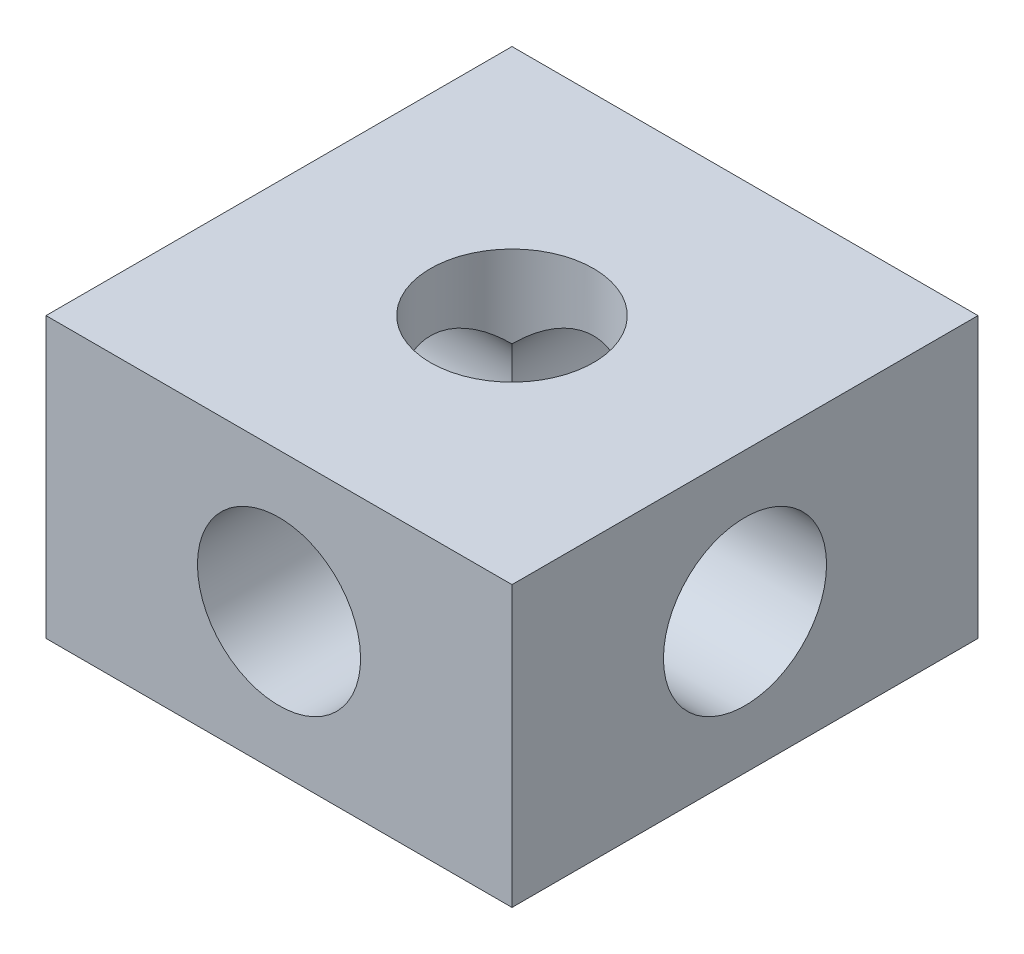
ISO-10303-21;
HEADER;
FILE_DESCRIPTION(('STEP AP214'),'2;1');
FILE_NAME('part.step','',(''),(''),'','','');
FILE_SCHEMA(('AUTOMOTIVE_DESIGN { 1 0 10303 214 1 1 1 1 }'));
ENDSEC;
DATA;
#1=APPLICATION_CONTEXT('core data for automotive mechanical design processes');
#2=APPLICATION_PROTOCOL_DEFINITION('international standard','automotive_design',2000,#1);
#3=PRODUCT_CONTEXT('',#1,'mechanical');
#4=PRODUCT('Part','Part','',(#3));
#5=PRODUCT_RELATED_PRODUCT_CATEGORY('part','',(#4));
#6=PRODUCT_DEFINITION_FORMATION('','',#4);
#7=PRODUCT_DEFINITION_CONTEXT('part definition',#1,'design');
#8=PRODUCT_DEFINITION('design','',#6,#7);
#9=PRODUCT_DEFINITION_SHAPE('','',#8);
#10=(LENGTH_UNIT() NAMED_UNIT(*) SI_UNIT(.MILLI.,.METRE.));
#11=(NAMED_UNIT(*) PLANE_ANGLE_UNIT() SI_UNIT($,.RADIAN.));
#12=(NAMED_UNIT(*) SI_UNIT($,.STERADIAN.) SOLID_ANGLE_UNIT());
#13=UNCERTAINTY_MEASURE_WITH_UNIT(LENGTH_MEASURE(1.E-05),#10,'distance_accuracy_value','');
#14=(GEOMETRIC_REPRESENTATION_CONTEXT(3) GLOBAL_UNCERTAINTY_ASSIGNED_CONTEXT((#13)) GLOBAL_UNIT_ASSIGNED_CONTEXT((#10,
#11,#12)) REPRESENTATION_CONTEXT('',''));
#15=CARTESIAN_POINT('',(0.,0.,0.));
#16=DIRECTION('',(0.,0.,1.));
#17=DIRECTION('',(1.,0.,0.));
#18=AXIS2_PLACEMENT_3D('',#15,#16,#17);
#19=CARTESIAN_POINT('',(0.,3.,0.));
#20=DIRECTION('',(0.,-1.,0.));
#21=DIRECTION('',(0.,0.,-1.));
#22=AXIS2_PLACEMENT_3D('',#19,#20,#21);
#23=CYLINDRICAL_SURFACE('',#22,1.75);
#24=CARTESIAN_POINT('',(0.,0.,0.));
#25=DIRECTION('',(0.707106781186547,-0.707106781186547,0.));
#26=DIRECTION('',(-0.707106781186547,-0.707106781186547,0.));
#27=AXIS2_PLACEMENT_3D('',#24,#25,#26);
#28=ELLIPSE('',#27,2.47487373415292,1.75);
#29=CARTESIAN_POINT('',(1.23743686707646,1.23743686707646,1.23743686707646));
#30=VERTEX_POINT('',#29);
#31=CARTESIAN_POINT('',(1.23743686707646,1.23743686707646,-1.23743686707646));
#32=VERTEX_POINT('',#31);
#33=EDGE_CURVE('E100',#30,#32,#28,.F.);
#34=ORIENTED_EDGE('',*,*,#33,.F.);
#35=CARTESIAN_POINT('',(0.,0.,0.));
#36=DIRECTION('',(0.,-0.707106781186547,0.707106781186547));
#37=DIRECTION('',(0.,-0.707106781186547,-0.707106781186547));
#38=AXIS2_PLACEMENT_3D('',#35,#36,#37);
#39=ELLIPSE('',#38,2.47487373415292,1.75);
#40=CARTESIAN_POINT('',(-1.23743686707646,1.23743686707646,1.23743686707646));
#41=VERTEX_POINT('',#40);
#42=EDGE_CURVE('E106',#41,#30,#39,.F.);
#43=ORIENTED_EDGE('',*,*,#42,.F.);
#44=CARTESIAN_POINT('',(0.,0.,0.));
#45=DIRECTION('',(-0.707106781186547,-0.707106781186547,0.));
#46=DIRECTION('',(0.707106781186547,-0.707106781186547,0.));
#47=AXIS2_PLACEMENT_3D('',#44,#45,#46);
#48=ELLIPSE('',#47,2.47487373415292,1.75);
#49=CARTESIAN_POINT('',(-1.23743686707646,1.23743686707646,-1.23743686707646));
#50=VERTEX_POINT('',#49);
#51=EDGE_CURVE('E59',#50,#41,#48,.F.);
#52=ORIENTED_EDGE('',*,*,#51,.F.);
#53=CARTESIAN_POINT('',(0.,0.,0.));
#54=DIRECTION('',(0.,-0.707106781186547,-0.707106781186547));
#55=DIRECTION('',(0.,-0.707106781186547,0.707106781186547));
#56=AXIS2_PLACEMENT_3D('',#53,#54,#55);
#57=ELLIPSE('',#56,2.47487373415292,1.75);
#58=EDGE_CURVE('E112',#32,#50,#57,.F.);
#59=ORIENTED_EDGE('',*,*,#58,.F.);
#60=EDGE_LOOP('',(#34,#43,#52,#59));
#61=FACE_BOUND('',#60,.T.);
#62=CARTESIAN_POINT('',(0.,3.,0.));
#63=DIRECTION('',(0.,1.,0.));
#64=DIRECTION('',(0.,0.,1.));
#65=AXIS2_PLACEMENT_3D('',#62,#63,#64);
#66=CIRCLE('',#65,1.75);
#67=CARTESIAN_POINT('',(0.,3.,1.75));
#68=VERTEX_POINT('',#67);
#69=EDGE_CURVE('E148',#68,#68,#66,.T.);
#70=ORIENTED_EDGE('',*,*,#69,.T.);
#71=EDGE_LOOP('',(#70));
#72=FACE_BOUND('',#71,.T.);
#73=ADVANCED_FACE('F36',(#61,#72),#23,.F.);
#74=CARTESIAN_POINT('',(0.,3.,0.));
#75=DIRECTION('',(0.,1.,0.));
#76=DIRECTION('',(0.,0.,1.));
#77=AXIS2_PLACEMENT_3D('',#74,#75,#76);
#78=PLANE('',#77);
#79=DIRECTION('',(0.,0.,-1.));
#80=VECTOR('',#79,1.);
#81=CARTESIAN_POINT('',(5.,3.,-5.));
#82=LINE('',#81,#80);
#83=CARTESIAN_POINT('',(5.,3.,5.));
#84=VERTEX_POINT('',#83);
#85=CARTESIAN_POINT('',(5.,3.,-5.));
#86=VERTEX_POINT('',#85);
#87=EDGE_CURVE('E140',#84,#86,#82,.T.);
#88=ORIENTED_EDGE('',*,*,#87,.T.);
#89=DIRECTION('',(-1.,0.,0.));
#90=VECTOR('',#89,1.);
#91=CARTESIAN_POINT('',(-5.,3.,-5.));
#92=LINE('',#91,#90);
#93=CARTESIAN_POINT('',(-5.,3.,-5.));
#94=VERTEX_POINT('',#93);
#95=EDGE_CURVE('E152',#86,#94,#92,.T.);
#96=ORIENTED_EDGE('',*,*,#95,.T.);
#97=DIRECTION('',(0.,0.,1.));
#98=VECTOR('',#97,1.);
#99=CARTESIAN_POINT('',(-5.,3.,-5.));
#100=LINE('',#99,#98);
#101=CARTESIAN_POINT('',(-5.,3.,5.));
#102=VERTEX_POINT('',#101);
#103=EDGE_CURVE('E150',#94,#102,#100,.T.);
#104=ORIENTED_EDGE('',*,*,#103,.T.);
#105=DIRECTION('',(1.,0.,0.));
#106=VECTOR('',#105,1.);
#107=CARTESIAN_POINT('',(-5.,3.,5.));
#108=LINE('',#107,#106);
#109=EDGE_CURVE('E137',#102,#84,#108,.T.);
#110=ORIENTED_EDGE('',*,*,#109,.T.);
#111=EDGE_LOOP('',(#88,#96,#104,#110));
#112=FACE_BOUND('',#111,.T.);
#113=ORIENTED_EDGE('',*,*,#69,.F.);
#114=EDGE_LOOP('',(#113));
#115=FACE_BOUND('',#114,.T.);
#116=ADVANCED_FACE('F216',(#112,#115),#78,.T.);
#117=CARTESIAN_POINT('',(0.,-3.,0.));
#118=DIRECTION('',(0.,1.,0.));
#119=DIRECTION('',(0.,0.,1.));
#120=AXIS2_PLACEMENT_3D('',#117,#118,#119);
#121=PLANE('',#120);
#122=DIRECTION('',(0.,0.,-1.));
#123=VECTOR('',#122,1.);
#124=CARTESIAN_POINT('',(5.,-3.,-5.));
#125=LINE('',#124,#123);
#126=CARTESIAN_POINT('',(5.,-3.,5.));
#127=VERTEX_POINT('',#126);
#128=CARTESIAN_POINT('',(5.,-3.,-5.));
#129=VERTEX_POINT('',#128);
#130=EDGE_CURVE('E145',#127,#129,#125,.T.);
#131=ORIENTED_EDGE('',*,*,#130,.F.);
#132=DIRECTION('',(1.,0.,0.));
#133=VECTOR('',#132,1.);
#134=CARTESIAN_POINT('',(-5.,-3.,5.));
#135=LINE('',#134,#133);
#136=CARTESIAN_POINT('',(-5.,-3.,5.));
#137=VERTEX_POINT('',#136);
#138=EDGE_CURVE('E138',#137,#127,#135,.T.);
#139=ORIENTED_EDGE('',*,*,#138,.F.);
#140=DIRECTION('',(0.,0.,1.));
#141=VECTOR('',#140,1.);
#142=CARTESIAN_POINT('',(-5.,-3.,-5.));
#143=LINE('',#142,#141);
#144=CARTESIAN_POINT('',(-5.,-3.,-5.));
#145=VERTEX_POINT('',#144);
#146=EDGE_CURVE('E141',#145,#137,#143,.T.);
#147=ORIENTED_EDGE('',*,*,#146,.F.);
#148=DIRECTION('',(-1.,0.,0.));
#149=VECTOR('',#148,1.);
#150=CARTESIAN_POINT('',(-5.,-3.,-5.));
#151=LINE('',#150,#149);
#152=EDGE_CURVE('E143',#129,#145,#151,.T.);
#153=ORIENTED_EDGE('',*,*,#152,.F.);
#154=EDGE_LOOP('',(#131,#139,#147,#153));
#155=FACE_BOUND('',#154,.T.);
#156=CARTESIAN_POINT('',(0.,-3.,0.));
#157=DIRECTION('',(0.,1.,0.));
#158=DIRECTION('',(0.,0.,1.));
#159=AXIS2_PLACEMENT_3D('',#156,#157,#158);
#160=CIRCLE('',#159,1.75);
#161=CARTESIAN_POINT('',(0.,-3.,1.75));
#162=VERTEX_POINT('',#161);
#163=EDGE_CURVE('E156',#162,#162,#160,.T.);
#164=ORIENTED_EDGE('',*,*,#163,.T.);
#165=EDGE_LOOP('',(#164));
#166=FACE_BOUND('',#165,.T.);
#167=ADVANCED_FACE('F210',(#155,#166),#121,.F.);
#168=CARTESIAN_POINT('',(5.,3.,-5.));
#169=DIRECTION('',(-1.,0.,0.));
#170=DIRECTION('',(0.,0.,1.));
#171=AXIS2_PLACEMENT_3D('',#168,#169,#170);
#172=PLANE('',#171);
#173=CARTESIAN_POINT('',(5.,0.,0.));
#174=DIRECTION('',(-1.,0.,0.));
#175=DIRECTION('',(0.,0.,1.));
#176=AXIS2_PLACEMENT_3D('',#173,#174,#175);
#177=CIRCLE('',#176,1.75);
#178=CARTESIAN_POINT('',(5.,0.,1.75));
#179=VERTEX_POINT('',#178);
#180=EDGE_CURVE('E167',#179,#179,#177,.T.);
#181=ORIENTED_EDGE('',*,*,#180,.T.);
#182=EDGE_LOOP('',(#181));
#183=FACE_BOUND('',#182,.T.);
#184=ORIENTED_EDGE('',*,*,#130,.T.);
#185=DIRECTION('',(0.,-1.,0.));
#186=VECTOR('',#185,1.);
#187=CARTESIAN_POINT('',(5.,3.,-5.));
#188=LINE('',#187,#186);
#189=EDGE_CURVE('E125',#86,#129,#188,.T.);
#190=ORIENTED_EDGE('',*,*,#189,.F.);
#191=ORIENTED_EDGE('',*,*,#87,.F.);
#192=DIRECTION('',(0.,-1.,0.));
#193=VECTOR('',#192,1.);
#194=CARTESIAN_POINT('',(5.,3.,5.));
#195=LINE('',#194,#193);
#196=EDGE_CURVE('E134',#84,#127,#195,.T.);
#197=ORIENTED_EDGE('',*,*,#196,.T.);
#198=EDGE_LOOP('',(#184,#190,#191,#197));
#199=FACE_BOUND('',#198,.T.);
#200=ADVANCED_FACE('F38',(#183,#199),#172,.F.);
#201=CARTESIAN_POINT('',(-5.,3.,-5.));
#202=DIRECTION('',(0.,0.,1.));
#203=DIRECTION('',(1.,0.,0.));
#204=AXIS2_PLACEMENT_3D('',#201,#202,#203);
#205=PLANE('',#204);
#206=CARTESIAN_POINT('',(0.,0.,-5.));
#207=DIRECTION('',(0.,0.,1.));
#208=DIRECTION('',(1.,0.,0.));
#209=AXIS2_PLACEMENT_3D('',#206,#207,#208);
#210=CIRCLE('',#209,1.75);
#211=CARTESIAN_POINT('',(1.75,0.,-5.));
#212=VERTEX_POINT('',#211);
#213=EDGE_CURVE('E159',#212,#212,#210,.T.);
#214=ORIENTED_EDGE('',*,*,#213,.T.);
#215=EDGE_LOOP('',(#214));
#216=FACE_BOUND('',#215,.T.);
#217=ORIENTED_EDGE('',*,*,#152,.T.);
#218=DIRECTION('',(0.,-1.,0.));
#219=VECTOR('',#218,1.);
#220=CARTESIAN_POINT('',(-5.,3.,-5.));
#221=LINE('',#220,#219);
#222=EDGE_CURVE('E128',#94,#145,#221,.T.);
#223=ORIENTED_EDGE('',*,*,#222,.F.);
#224=ORIENTED_EDGE('',*,*,#95,.F.);
#225=ORIENTED_EDGE('',*,*,#189,.T.);
#226=EDGE_LOOP('',(#217,#223,#224,#225));
#227=FACE_BOUND('',#226,.T.);
#228=ADVANCED_FACE('F198',(#216,#227),#205,.F.);
#229=CARTESIAN_POINT('',(-5.,3.,-5.));
#230=DIRECTION('',(1.,0.,0.));
#231=DIRECTION('',(0.,0.,-1.));
#232=AXIS2_PLACEMENT_3D('',#229,#230,#231);
#233=PLANE('',#232);
#234=CARTESIAN_POINT('',(-5.,0.,0.));
#235=DIRECTION('',(1.,0.,0.));
#236=DIRECTION('',(0.,0.,-1.));
#237=AXIS2_PLACEMENT_3D('',#234,#235,#236);
#238=CIRCLE('',#237,1.75);
#239=CARTESIAN_POINT('',(-5.,0.,-1.75));
#240=VERTEX_POINT('',#239);
#241=EDGE_CURVE('E170',#240,#240,#238,.T.);
#242=ORIENTED_EDGE('',*,*,#241,.T.);
#243=EDGE_LOOP('',(#242));
#244=FACE_BOUND('',#243,.T.);
#245=ORIENTED_EDGE('',*,*,#146,.T.);
#246=DIRECTION('',(0.,-1.,0.));
#247=VECTOR('',#246,1.);
#248=CARTESIAN_POINT('',(-5.,3.,5.));
#249=LINE('',#248,#247);
#250=EDGE_CURVE('E131',#102,#137,#249,.T.);
#251=ORIENTED_EDGE('',*,*,#250,.F.);
#252=ORIENTED_EDGE('',*,*,#103,.F.);
#253=ORIENTED_EDGE('',*,*,#222,.T.);
#254=EDGE_LOOP('',(#245,#251,#252,#253));
#255=FACE_BOUND('',#254,.T.);
#256=ADVANCED_FACE('F194',(#244,#255),#233,.F.);
#257=CARTESIAN_POINT('',(-5.,3.,5.));
#258=DIRECTION('',(0.,0.,-1.));
#259=DIRECTION('',(-1.,0.,0.));
#260=AXIS2_PLACEMENT_3D('',#257,#258,#259);
#261=PLANE('',#260);
#262=CARTESIAN_POINT('',(0.,0.,5.));
#263=DIRECTION('',(0.,0.,-1.));
#264=DIRECTION('',(-1.,0.,0.));
#265=AXIS2_PLACEMENT_3D('',#262,#263,#264);
#266=CIRCLE('',#265,1.75);
#267=CARTESIAN_POINT('',(-1.75,0.,5.));
#268=VERTEX_POINT('',#267);
#269=EDGE_CURVE('E164',#268,#268,#266,.T.);
#270=ORIENTED_EDGE('',*,*,#269,.T.);
#271=EDGE_LOOP('',(#270));
#272=FACE_BOUND('',#271,.T.);
#273=ORIENTED_EDGE('',*,*,#138,.T.);
#274=ORIENTED_EDGE('',*,*,#196,.F.);
#275=ORIENTED_EDGE('',*,*,#109,.F.);
#276=ORIENTED_EDGE('',*,*,#250,.T.);
#277=EDGE_LOOP('',(#273,#274,#275,#276));
#278=FACE_BOUND('',#277,.T.);
#279=ADVANCED_FACE('F197',(#272,#278),#261,.F.);
#280=CARTESIAN_POINT('',(0.,0.,0.));
#281=DIRECTION('',(0.707106781186547,-0.707106781186547,0.));
#282=DIRECTION('',(-0.707106781186547,-0.707106781186547,0.));
#283=AXIS2_PLACEMENT_3D('',#280,#281,#282);
#284=ELLIPSE('',#283,2.47487373415292,1.75);
#285=CARTESIAN_POINT('',(-1.23743686707646,-1.23743686707646,1.23743686707646));
#286=VERTEX_POINT('',#285);
#287=CARTESIAN_POINT('',(-1.23743686707646,-1.23743686707646,-1.23743686707646));
#288=VERTEX_POINT('',#287);
#289=EDGE_CURVE('E177',#286,#288,#284,.T.);
#290=ORIENTED_EDGE('',*,*,#289,.F.);
#291=CARTESIAN_POINT('',(0.,0.,0.));
#292=DIRECTION('',(0.,-0.707106781186547,-0.707106781186547));
#293=DIRECTION('',(0.,-0.707106781186547,0.707106781186547));
#294=AXIS2_PLACEMENT_3D('',#291,#292,#293);
#295=ELLIPSE('',#294,2.47487373415292,1.75);
#296=CARTESIAN_POINT('',(1.23743686707646,-1.23743686707646,1.23743686707646));
#297=VERTEX_POINT('',#296);
#298=EDGE_CURVE('E120',#297,#286,#295,.T.);
#299=ORIENTED_EDGE('',*,*,#298,.F.);
#300=CARTESIAN_POINT('',(0.,0.,0.));
#301=DIRECTION('',(-0.707106781186547,-0.707106781186547,0.));
#302=DIRECTION('',(0.707106781186547,-0.707106781186547,0.));
#303=AXIS2_PLACEMENT_3D('',#300,#301,#302);
#304=ELLIPSE('',#303,2.47487373415292,1.75);
#305=CARTESIAN_POINT('',(1.23743686707646,-1.23743686707646,-1.23743686707646));
#306=VERTEX_POINT('',#305);
#307=EDGE_CURVE('E51',#306,#297,#304,.T.);
#308=ORIENTED_EDGE('',*,*,#307,.F.);
#309=CARTESIAN_POINT('',(0.,0.,0.));
#310=DIRECTION('',(0.,-0.707106781186547,0.707106781186547));
#311=DIRECTION('',(0.,-0.707106781186547,-0.707106781186547));
#312=AXIS2_PLACEMENT_3D('',#309,#310,#311);
#313=ELLIPSE('',#312,2.47487373415292,1.75);
#314=EDGE_CURVE('E117',#288,#306,#313,.T.);
#315=ORIENTED_EDGE('',*,*,#314,.F.);
#316=EDGE_LOOP('',(#290,#299,#308,#315));
#317=FACE_BOUND('',#316,.T.);
#318=ORIENTED_EDGE('',*,*,#163,.F.);
#319=EDGE_LOOP('',(#318));
#320=FACE_BOUND('',#319,.T.);
#321=ADVANCED_FACE('F186',(#317,#320),#23,.F.);
#322=CARTESIAN_POINT('',(0.,0.,-8.5));
#323=DIRECTION('',(0.,0.,1.));
#324=DIRECTION('',(1.,0.,0.));
#325=AXIS2_PLACEMENT_3D('',#322,#323,#324);
#326=CYLINDRICAL_SURFACE('',#325,1.75);
#327=ORIENTED_EDGE('',*,*,#314,.T.);
#328=CARTESIAN_POINT('',(0.,0.,0.));
#329=DIRECTION('',(0.707106781186547,0.,0.707106781186547));
#330=DIRECTION('',(-0.707106781186547,0.,0.707106781186547));
#331=AXIS2_PLACEMENT_3D('',#328,#329,#330);
#332=ELLIPSE('',#331,2.47487373415292,1.75);
#333=EDGE_CURVE('E113',#306,#32,#332,.T.);
#334=ORIENTED_EDGE('',*,*,#333,.T.);
#335=ORIENTED_EDGE('',*,*,#58,.T.);
#336=CARTESIAN_POINT('',(0.,0.,0.));
#337=DIRECTION('',(-0.707106781186547,0.,0.707106781186547));
#338=DIRECTION('',(0.707106781186547,0.,0.707106781186547));
#339=AXIS2_PLACEMENT_3D('',#336,#337,#338);
#340=ELLIPSE('',#339,2.47487373415292,1.75);
#341=EDGE_CURVE('E173',#50,#288,#340,.T.);
#342=ORIENTED_EDGE('',*,*,#341,.T.);
#343=EDGE_LOOP('',(#327,#334,#335,#342));
#344=FACE_BOUND('',#343,.T.);
#345=ORIENTED_EDGE('',*,*,#213,.F.);
#346=EDGE_LOOP('',(#345));
#347=FACE_BOUND('',#346,.T.);
#348=ADVANCED_FACE('F181',(#344,#347),#326,.F.);
#349=ORIENTED_EDGE('',*,*,#298,.T.);
#350=CARTESIAN_POINT('',(0.,0.,0.));
#351=DIRECTION('',(0.707106781186547,0.,0.707106781186547));
#352=DIRECTION('',(-0.707106781186547,0.,0.707106781186547));
#353=AXIS2_PLACEMENT_3D('',#350,#351,#352);
#354=ELLIPSE('',#353,2.47487373415292,1.75);
#355=EDGE_CURVE('E11',#286,#41,#354,.F.);
#356=ORIENTED_EDGE('',*,*,#355,.T.);
#357=ORIENTED_EDGE('',*,*,#42,.T.);
#358=CARTESIAN_POINT('',(0.,0.,0.));
#359=DIRECTION('',(-0.707106781186547,0.,0.707106781186547));
#360=DIRECTION('',(0.707106781186547,0.,0.707106781186547));
#361=AXIS2_PLACEMENT_3D('',#358,#359,#360);
#362=ELLIPSE('',#361,2.47487373415292,1.75);
#363=EDGE_CURVE('E44',#30,#297,#362,.F.);
#364=ORIENTED_EDGE('',*,*,#363,.T.);
#365=EDGE_LOOP('',(#349,#356,#357,#364));
#366=FACE_BOUND('',#365,.T.);
#367=ORIENTED_EDGE('',*,*,#269,.F.);
#368=EDGE_LOOP('',(#367));
#369=FACE_BOUND('',#368,.T.);
#370=ADVANCED_FACE('F115',(#366,#369),#326,.F.);
#371=CARTESIAN_POINT('',(-8.5,0.,0.));
#372=DIRECTION('',(1.,0.,0.));
#373=DIRECTION('',(0.,0.,-1.));
#374=AXIS2_PLACEMENT_3D('',#371,#372,#373);
#375=CYLINDRICAL_SURFACE('',#374,1.75);
#376=ORIENTED_EDGE('',*,*,#307,.T.);
#377=ORIENTED_EDGE('',*,*,#363,.F.);
#378=ORIENTED_EDGE('',*,*,#33,.T.);
#379=ORIENTED_EDGE('',*,*,#333,.F.);
#380=EDGE_LOOP('',(#376,#377,#378,#379));
#381=FACE_BOUND('',#380,.T.);
#382=ORIENTED_EDGE('',*,*,#180,.F.);
#383=EDGE_LOOP('',(#382));
#384=FACE_BOUND('',#383,.T.);
#385=ADVANCED_FACE('F98',(#381,#384),#375,.F.);
#386=ORIENTED_EDGE('',*,*,#51,.T.);
#387=ORIENTED_EDGE('',*,*,#355,.F.);
#388=ORIENTED_EDGE('',*,*,#289,.T.);
#389=ORIENTED_EDGE('',*,*,#341,.F.);
#390=EDGE_LOOP('',(#386,#387,#388,#389));
#391=FACE_BOUND('',#390,.T.);
#392=ORIENTED_EDGE('',*,*,#241,.F.);
#393=EDGE_LOOP('',(#392));
#394=FACE_BOUND('',#393,.T.);
#395=ADVANCED_FACE('F188',(#391,#394),#375,.F.);
#396=CLOSED_SHELL('',(#73,#116,#167,#200,#228,#256,#279,#321,#348,#370,#385,#395));
#397=MANIFOLD_SOLID_BREP('B2',#396);
#398=ADVANCED_BREP_SHAPE_REPRESENTATION('',(#18,#397),#14);
#399=SHAPE_DEFINITION_REPRESENTATION(#9,#398);
ENDSEC;
END-ISO-10303-21;
